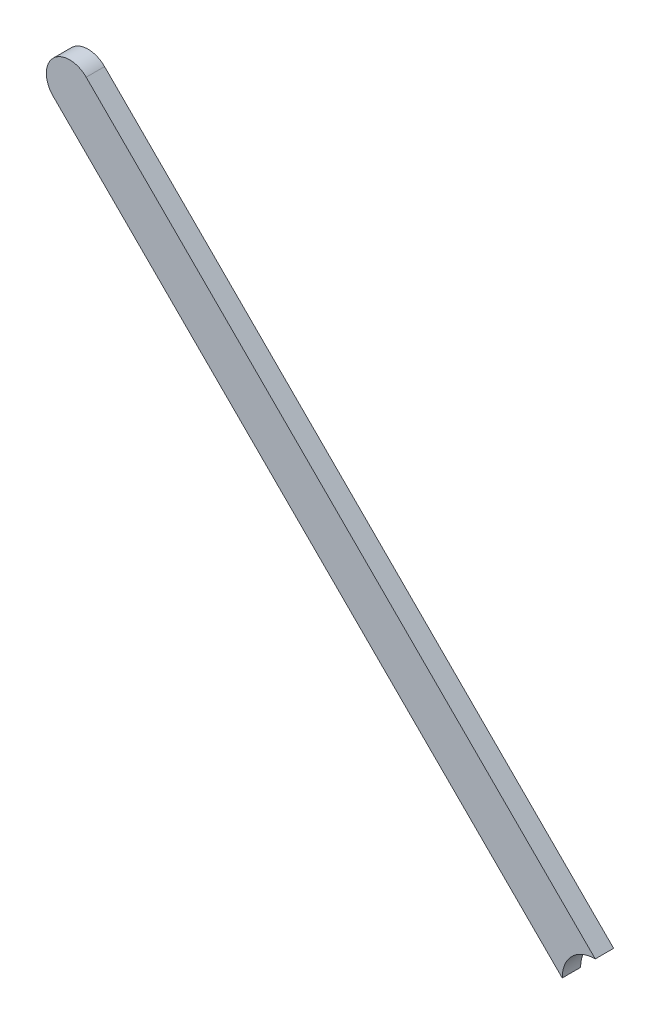
ISO-10303-21;
HEADER;
FILE_DESCRIPTION(('STEP AP214'),'2;1');
FILE_NAME('part.step','',(''),(''),'','','');
FILE_SCHEMA(('AUTOMOTIVE_DESIGN { 1 0 10303 214 1 1 1 1 }'));
ENDSEC;
DATA;
#1=APPLICATION_CONTEXT('core data for automotive mechanical design processes');
#2=APPLICATION_PROTOCOL_DEFINITION('international standard','automotive_design',2000,#1);
#3=PRODUCT_CONTEXT('',#1,'mechanical');
#4=PRODUCT('Part','Part','',(#3));
#5=PRODUCT_RELATED_PRODUCT_CATEGORY('part','',(#4));
#6=PRODUCT_DEFINITION_FORMATION('','',#4);
#7=PRODUCT_DEFINITION_CONTEXT('part definition',#1,'design');
#8=PRODUCT_DEFINITION('design','',#6,#7);
#9=PRODUCT_DEFINITION_SHAPE('','',#8);
#10=(LENGTH_UNIT() NAMED_UNIT(*) SI_UNIT(.MILLI.,.METRE.));
#11=(NAMED_UNIT(*) PLANE_ANGLE_UNIT() SI_UNIT($,.RADIAN.));
#12=(NAMED_UNIT(*) SI_UNIT($,.STERADIAN.) SOLID_ANGLE_UNIT());
#13=UNCERTAINTY_MEASURE_WITH_UNIT(LENGTH_MEASURE(1.E-05),#10,'distance_accuracy_value','');
#14=(GEOMETRIC_REPRESENTATION_CONTEXT(3) GLOBAL_UNCERTAINTY_ASSIGNED_CONTEXT((#13)) GLOBAL_UNIT_ASSIGNED_CONTEXT((#10,
#11,#12)) REPRESENTATION_CONTEXT('',''));
#15=CARTESIAN_POINT('',(0.,0.,0.));
#16=DIRECTION('',(0.,0.,1.));
#17=DIRECTION('',(1.,0.,0.));
#18=AXIS2_PLACEMENT_3D('',#15,#16,#17);
#19=CARTESIAN_POINT('',(118.1843966,121.99439406,0.));
#20=DIRECTION('',(0.707106781186547,0.707106781186548,0.));
#21=DIRECTION('',(0.707106781186548,-0.707106781186547,0.));
#22=AXIS2_PLACEMENT_3D('',#19,#20,#21);
#23=PLANE('',#22);
#24=DIRECTION('',(0.707106781186548,-0.707106781186547,0.));
#25=VECTOR('',#24,1.);
#26=CARTESIAN_POINT('',(118.1843966,121.99439406,0.1999996));
#27=LINE('',#26,#25);
#28=CARTESIAN_POINT('',(118.1843966,121.99439406,0.1999996));
#29=VERTEX_POINT('',#28);
#30=CARTESIAN_POINT('',(123.723418506201,116.455372153798,0.1999996));
#31=VERTEX_POINT('',#30);
#32=EDGE_CURVE('E11',#29,#31,#27,.T.);
#33=ORIENTED_EDGE('',*,*,#32,.F.);
#34=DIRECTION('',(0.,0.,1.));
#35=VECTOR('',#34,1.);
#36=CARTESIAN_POINT('',(118.1843966,121.99439406,0.));
#37=LINE('',#36,#35);
#38=CARTESIAN_POINT('',(118.1843966,121.99439406,0.));
#39=VERTEX_POINT('',#38);
#40=EDGE_CURVE('E24',#39,#29,#37,.T.);
#41=ORIENTED_EDGE('',*,*,#40,.F.);
#42=DIRECTION('',(0.707106781186548,-0.707106781186547,0.));
#43=VECTOR('',#42,1.);
#44=CARTESIAN_POINT('',(118.1843966,121.99439406,0.));
#45=LINE('',#44,#43);
#46=CARTESIAN_POINT('',(123.723418506201,116.455372153798,0.));
#47=VERTEX_POINT('',#46);
#48=EDGE_CURVE('E75',#39,#47,#45,.T.);
#49=ORIENTED_EDGE('',*,*,#48,.T.);
#50=DIRECTION('',(0.,0.,1.));
#51=VECTOR('',#50,1.);
#52=CARTESIAN_POINT('',(123.723418506201,116.455372153798,0.));
#53=LINE('',#52,#51);
#54=EDGE_CURVE('E37',#47,#31,#53,.T.);
#55=ORIENTED_EDGE('',*,*,#54,.T.);
#56=EDGE_LOOP('',(#33,#41,#49,#55));
#57=FACE_BOUND('',#56,.T.);
#58=ADVANCED_FACE('F17',(#57),#23,.F.);
#59=CARTESIAN_POINT('',(124.079,116.459,0.));
#60=DIRECTION('',(0.,0.,-1.));
#61=DIRECTION('',(1.,0.,0.));
#62=AXIS2_PLACEMENT_3D('',#59,#60,#61);
#63=CYLINDRICAL_SURFACE('',#62,0.3556);
#64=DIRECTION('',(0.,0.,1.));
#65=VECTOR('',#64,1.);
#66=CARTESIAN_POINT('',(124.082630412393,116.814581467607,0.));
#67=LINE('',#66,#65);
#68=CARTESIAN_POINT('',(124.082630412393,116.814581467607,0.));
#69=VERTEX_POINT('',#68);
#70=CARTESIAN_POINT('',(124.082630412393,116.814581467607,0.1999996));
#71=VERTEX_POINT('',#70);
#72=EDGE_CURVE('E67',#69,#71,#67,.T.);
#73=ORIENTED_EDGE('',*,*,#72,.T.);
#74=CARTESIAN_POINT('',(124.079,116.459,0.1999996));
#75=DIRECTION('',(0.,0.,1.));
#76=DIRECTION('',(1.,0.,0.));
#77=AXIS2_PLACEMENT_3D('',#74,#75,#76);
#78=CIRCLE('',#77,0.3556);
#79=EDGE_CURVE('E82',#71,#31,#78,.T.);
#80=ORIENTED_EDGE('',*,*,#79,.T.);
#81=ORIENTED_EDGE('',*,*,#54,.F.);
#82=CARTESIAN_POINT('',(124.079,116.459,0.));
#83=DIRECTION('',(0.,0.,1.));
#84=DIRECTION('',(1.,0.,0.));
#85=AXIS2_PLACEMENT_3D('',#82,#83,#84);
#86=CIRCLE('',#85,0.3556);
#87=EDGE_CURVE('E80',#69,#47,#86,.T.);
#88=ORIENTED_EDGE('',*,*,#87,.F.);
#89=EDGE_LOOP('',(#73,#80,#81,#88));
#90=FACE_BOUND('',#89,.T.);
#91=ADVANCED_FACE('F88',(#90),#63,.F.);
#92=CARTESIAN_POINT('',(124.082630412393,116.814581467607,0.));
#93=DIRECTION('',(-0.707106781186548,-0.707106781186548,0.));
#94=DIRECTION('',(-0.707106781186548,0.707106781186548,0.));
#95=AXIS2_PLACEMENT_3D('',#92,#93,#94);
#96=PLANE('',#95);
#97=DIRECTION('',(-0.707106781186548,0.707106781186548,0.));
#98=VECTOR('',#97,1.);
#99=CARTESIAN_POINT('',(126.69368108,114.2035308,0.1999996));
#100=LINE('',#99,#98);
#101=CARTESIAN_POINT('',(118.54360594,122.35360594,0.1999996));
#102=VERTEX_POINT('',#101);
#103=EDGE_CURVE('E71',#71,#102,#100,.T.);
#104=ORIENTED_EDGE('',*,*,#103,.F.);
#105=ORIENTED_EDGE('',*,*,#72,.F.);
#106=DIRECTION('',(-0.707106781186548,0.707106781186548,0.));
#107=VECTOR('',#106,1.);
#108=CARTESIAN_POINT('',(126.69368108,114.2035308,0.));
#109=LINE('',#108,#107);
#110=CARTESIAN_POINT('',(118.54360594,122.35360594,0.));
#111=VERTEX_POINT('',#110);
#112=EDGE_CURVE('E63',#69,#111,#109,.T.);
#113=ORIENTED_EDGE('',*,*,#112,.T.);
#114=DIRECTION('',(0.,0.,1.));
#115=VECTOR('',#114,1.);
#116=CARTESIAN_POINT('',(118.54360594,122.35360594,0.));
#117=LINE('',#116,#115);
#118=EDGE_CURVE('E53',#111,#102,#117,.T.);
#119=ORIENTED_EDGE('',*,*,#118,.T.);
#120=EDGE_LOOP('',(#104,#105,#113,#119));
#121=FACE_BOUND('',#120,.T.);
#122=ADVANCED_FACE('F66',(#121),#96,.F.);
#123=CARTESIAN_POINT('',(118.36400127,122.174,0.));
#124=DIRECTION('',(0.,0.,-1.));
#125=DIRECTION('',(0.707104281184673,0.707109281179584,0.));
#126=AXIS2_PLACEMENT_3D('',#123,#124,#125);
#127=CYLINDRICAL_SURFACE('',#126,0.254000258206741);
#128=CARTESIAN_POINT('',(118.36400127,122.174,0.1999996));
#129=DIRECTION('',(0.,0.,1.));
#130=DIRECTION('',(0.707104281184673,0.707109281179584,0.));
#131=AXIS2_PLACEMENT_3D('',#128,#129,#130);
#132=CIRCLE('',#131,0.254000258206741);
#133=EDGE_CURVE('E59',#102,#29,#132,.T.);
#134=ORIENTED_EDGE('',*,*,#133,.F.);
#135=ORIENTED_EDGE('',*,*,#118,.F.);
#136=CARTESIAN_POINT('',(118.36400127,122.174,0.));
#137=DIRECTION('',(0.,0.,1.));
#138=DIRECTION('',(0.707104281184673,0.707109281179584,0.));
#139=AXIS2_PLACEMENT_3D('',#136,#137,#138);
#140=CIRCLE('',#139,0.254000258206741);
#141=EDGE_CURVE('E57',#111,#39,#140,.T.);
#142=ORIENTED_EDGE('',*,*,#141,.T.);
#143=ORIENTED_EDGE('',*,*,#40,.T.);
#144=EDGE_LOOP('',(#134,#135,#142,#143));
#145=FACE_BOUND('',#144,.T.);
#146=ADVANCED_FACE('F55',(#145),#127,.T.);
#147=CARTESIAN_POINT('',(118.1843966,121.99439406,0.));
#148=DIRECTION('',(0.,0.,-1.));
#149=DIRECTION('',(-1.,0.,0.));
#150=AXIS2_PLACEMENT_3D('',#147,#148,#149);
#151=PLANE('',#150);
#152=ORIENTED_EDGE('',*,*,#48,.F.);
#153=ORIENTED_EDGE('',*,*,#141,.F.);
#154=ORIENTED_EDGE('',*,*,#112,.F.);
#155=ORIENTED_EDGE('',*,*,#87,.T.);
#156=EDGE_LOOP('',(#152,#153,#154,#155));
#157=FACE_BOUND('',#156,.T.);
#158=ADVANCED_FACE('F74',(#157),#151,.T.);
#159=CARTESIAN_POINT('',(118.1843966,121.99439406,0.1999996));
#160=DIRECTION('',(0.,0.,-1.));
#161=DIRECTION('',(-1.,0.,0.));
#162=AXIS2_PLACEMENT_3D('',#159,#160,#161);
#163=PLANE('',#162);
#164=ORIENTED_EDGE('',*,*,#133,.T.);
#165=ORIENTED_EDGE('',*,*,#32,.T.);
#166=ORIENTED_EDGE('',*,*,#79,.F.);
#167=ORIENTED_EDGE('',*,*,#103,.T.);
#168=EDGE_LOOP('',(#164,#165,#166,#167));
#169=FACE_BOUND('',#168,.T.);
#170=ADVANCED_FACE('F91',(#169),#163,.F.);
#171=CLOSED_SHELL('',(#58,#91,#122,#146,#158,#170));
#172=MANIFOLD_SOLID_BREP('B1',#171);
#173=ADVANCED_BREP_SHAPE_REPRESENTATION('',(#18,#172),#14);
#174=SHAPE_DEFINITION_REPRESENTATION(#9,#173);
ENDSEC;
END-ISO-10303-21;
